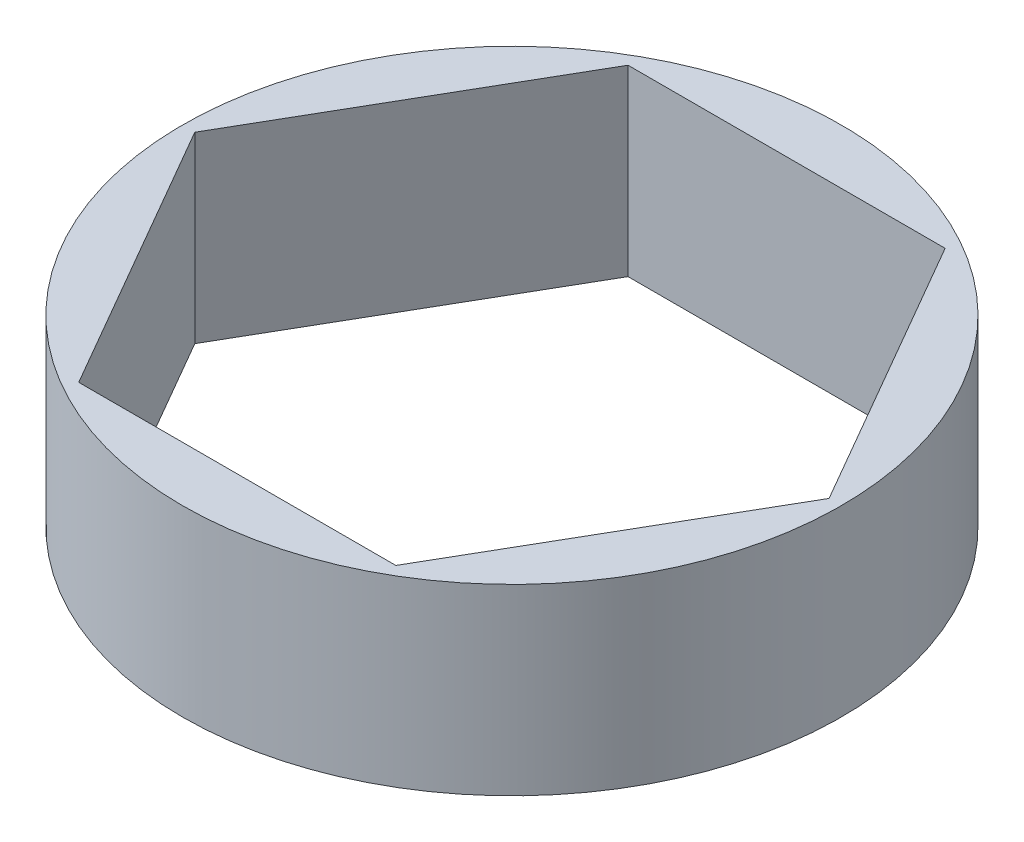
ISO-10303-21;
HEADER;
FILE_DESCRIPTION(('STEP AP214'),'2;1');
FILE_NAME('part.step','',(''),(''),'','','');
FILE_SCHEMA(('AUTOMOTIVE_DESIGN { 1 0 10303 214 1 1 1 1 }'));
ENDSEC;
DATA;
#1=APPLICATION_CONTEXT('core data for automotive mechanical design processes');
#2=APPLICATION_PROTOCOL_DEFINITION('international standard','automotive_design',2000,#1);
#3=PRODUCT_CONTEXT('',#1,'mechanical');
#4=PRODUCT('Part','Part','',(#3));
#5=PRODUCT_RELATED_PRODUCT_CATEGORY('part','',(#4));
#6=PRODUCT_DEFINITION_FORMATION('','',#4);
#7=PRODUCT_DEFINITION_CONTEXT('part definition',#1,'design');
#8=PRODUCT_DEFINITION('design','',#6,#7);
#9=PRODUCT_DEFINITION_SHAPE('','',#8);
#10=(LENGTH_UNIT() NAMED_UNIT(*) SI_UNIT(.MILLI.,.METRE.));
#11=(NAMED_UNIT(*) PLANE_ANGLE_UNIT() SI_UNIT($,.RADIAN.));
#12=(NAMED_UNIT(*) SI_UNIT($,.STERADIAN.) SOLID_ANGLE_UNIT());
#13=UNCERTAINTY_MEASURE_WITH_UNIT(LENGTH_MEASURE(1.E-05),#10,'distance_accuracy_value','');
#14=(GEOMETRIC_REPRESENTATION_CONTEXT(3) GLOBAL_UNCERTAINTY_ASSIGNED_CONTEXT((#13)) GLOBAL_UNIT_ASSIGNED_CONTEXT((#10,
#11,#12)) REPRESENTATION_CONTEXT('',''));
#15=CARTESIAN_POINT('',(0.,0.,0.));
#16=DIRECTION('',(0.,0.,1.));
#17=DIRECTION('',(1.,0.,0.));
#18=AXIS2_PLACEMENT_3D('',#15,#16,#17);
#19=CARTESIAN_POINT('',(0.,5.,0.));
#20=DIRECTION('',(0.,1.,0.));
#21=DIRECTION('',(0.,0.,1.));
#22=AXIS2_PLACEMENT_3D('',#19,#20,#21);
#23=PLANE('',#22);
#24=CARTESIAN_POINT('',(0.,5.,0.));
#25=DIRECTION('',(0.,1.,0.));
#26=DIRECTION('',(0.,0.,1.));
#27=AXIS2_PLACEMENT_3D('',#24,#25,#26);
#28=CIRCLE('',#27,9.);
#29=CARTESIAN_POINT('',(0.,5.,9.));
#30=VERTEX_POINT('',#29);
#31=EDGE_CURVE('E11',#30,#30,#28,.T.);
#32=ORIENTED_EDGE('',*,*,#31,.T.);
#33=EDGE_LOOP('',(#32));
#34=FACE_BOUND('',#33,.T.);
#35=DIRECTION('',(-0.5,0.,-0.866025403784439));
#36=VECTOR('',#35,1.);
#37=CARTESIAN_POINT('',(8.66025403784439,5.,0.));
#38=LINE('',#37,#36);
#39=CARTESIAN_POINT('',(8.66025403784439,5.,0.));
#40=VERTEX_POINT('',#39);
#41=CARTESIAN_POINT('',(4.33012701892219,5.,-7.5));
#42=VERTEX_POINT('',#41);
#43=EDGE_CURVE('E103',#40,#42,#38,.T.);
#44=ORIENTED_EDGE('',*,*,#43,.F.);
#45=DIRECTION('',(0.5,0.,-0.866025403784439));
#46=VECTOR('',#45,1.);
#47=CARTESIAN_POINT('',(4.33012701892219,5.,7.5));
#48=LINE('',#47,#46);
#49=CARTESIAN_POINT('',(4.33012701892219,5.,7.5));
#50=VERTEX_POINT('',#49);
#51=EDGE_CURVE('E94',#50,#40,#48,.T.);
#52=ORIENTED_EDGE('',*,*,#51,.F.);
#53=DIRECTION('',(1.,0.,0.));
#54=VECTOR('',#53,1.);
#55=CARTESIAN_POINT('',(-4.33012701892219,5.,7.5));
#56=LINE('',#55,#54);
#57=CARTESIAN_POINT('',(-4.33012701892219,5.,7.5));
#58=VERTEX_POINT('',#57);
#59=EDGE_CURVE('E128',#58,#50,#56,.T.);
#60=ORIENTED_EDGE('',*,*,#59,.F.);
#61=DIRECTION('',(0.5,0.,0.866025403784439));
#62=VECTOR('',#61,1.);
#63=CARTESIAN_POINT('',(-8.66025403784439,5.,0.));
#64=LINE('',#63,#62);
#65=CARTESIAN_POINT('',(-8.66025403784439,5.,0.));
#66=VERTEX_POINT('',#65);
#67=EDGE_CURVE('E125',#66,#58,#64,.T.);
#68=ORIENTED_EDGE('',*,*,#67,.F.);
#69=DIRECTION('',(-0.5,0.,0.866025403784439));
#70=VECTOR('',#69,1.);
#71=CARTESIAN_POINT('',(-4.33012701892219,5.,-7.5));
#72=LINE('',#71,#70);
#73=CARTESIAN_POINT('',(-4.33012701892219,5.,-7.5));
#74=VERTEX_POINT('',#73);
#75=EDGE_CURVE('E120',#74,#66,#72,.T.);
#76=ORIENTED_EDGE('',*,*,#75,.F.);
#77=DIRECTION('',(-1.,0.,0.));
#78=VECTOR('',#77,1.);
#79=CARTESIAN_POINT('',(4.33012701892219,5.,-7.5));
#80=LINE('',#79,#78);
#81=EDGE_CURVE('E116',#42,#74,#80,.T.);
#82=ORIENTED_EDGE('',*,*,#81,.F.);
#83=EDGE_LOOP('',(#44,#52,#60,#68,#76,#82));
#84=FACE_BOUND('',#83,.T.);
#85=ADVANCED_FACE('F40',(#34,#84),#23,.T.);
#86=CARTESIAN_POINT('',(0.,0.,0.));
#87=DIRECTION('',(0.,1.,0.));
#88=DIRECTION('',(0.,0.,1.));
#89=AXIS2_PLACEMENT_3D('',#86,#87,#88);
#90=PLANE('',#89);
#91=CARTESIAN_POINT('',(0.,0.,0.));
#92=DIRECTION('',(0.,1.,0.));
#93=DIRECTION('',(0.,0.,1.));
#94=AXIS2_PLACEMENT_3D('',#91,#92,#93);
#95=CIRCLE('',#94,9.);
#96=CARTESIAN_POINT('',(0.,0.,9.));
#97=VERTEX_POINT('',#96);
#98=EDGE_CURVE('E44',#97,#97,#95,.T.);
#99=ORIENTED_EDGE('',*,*,#98,.F.);
#100=EDGE_LOOP('',(#99));
#101=FACE_BOUND('',#100,.T.);
#102=DIRECTION('',(0.5,0.,-0.866025403784439));
#103=VECTOR('',#102,1.);
#104=CARTESIAN_POINT('',(4.33012701892219,0.,7.5));
#105=LINE('',#104,#103);
#106=CARTESIAN_POINT('',(4.33012701892219,0.,7.5));
#107=VERTEX_POINT('',#106);
#108=CARTESIAN_POINT('',(8.66025403784439,0.,0.));
#109=VERTEX_POINT('',#108);
#110=EDGE_CURVE('E64',#107,#109,#105,.T.);
#111=ORIENTED_EDGE('',*,*,#110,.T.);
#112=DIRECTION('',(-0.5,0.,-0.866025403784439));
#113=VECTOR('',#112,1.);
#114=CARTESIAN_POINT('',(8.66025403784439,0.,0.));
#115=LINE('',#114,#113);
#116=CARTESIAN_POINT('',(4.33012701892219,0.,-7.5));
#117=VERTEX_POINT('',#116);
#118=EDGE_CURVE('E110',#109,#117,#115,.T.);
#119=ORIENTED_EDGE('',*,*,#118,.T.);
#120=DIRECTION('',(-1.,0.,0.));
#121=VECTOR('',#120,1.);
#122=CARTESIAN_POINT('',(4.33012701892219,0.,-7.5));
#123=LINE('',#122,#121);
#124=CARTESIAN_POINT('',(-4.33012701892219,0.,-7.5));
#125=VERTEX_POINT('',#124);
#126=EDGE_CURVE('E135',#117,#125,#123,.T.);
#127=ORIENTED_EDGE('',*,*,#126,.T.);
#128=DIRECTION('',(-0.5,0.,0.866025403784439));
#129=VECTOR('',#128,1.);
#130=CARTESIAN_POINT('',(-4.33012701892219,0.,-7.5));
#131=LINE('',#130,#129);
#132=CARTESIAN_POINT('',(-8.66025403784439,0.,0.));
#133=VERTEX_POINT('',#132);
#134=EDGE_CURVE('E139',#125,#133,#131,.T.);
#135=ORIENTED_EDGE('',*,*,#134,.T.);
#136=DIRECTION('',(0.5,0.,0.866025403784439));
#137=VECTOR('',#136,1.);
#138=CARTESIAN_POINT('',(-8.66025403784439,0.,0.));
#139=LINE('',#138,#137);
#140=CARTESIAN_POINT('',(-4.33012701892219,0.,7.5));
#141=VERTEX_POINT('',#140);
#142=EDGE_CURVE('E143',#133,#141,#139,.T.);
#143=ORIENTED_EDGE('',*,*,#142,.T.);
#144=DIRECTION('',(1.,0.,0.));
#145=VECTOR('',#144,1.);
#146=CARTESIAN_POINT('',(-4.33012701892219,0.,7.5));
#147=LINE('',#146,#145);
#148=EDGE_CURVE('E104',#141,#107,#147,.T.);
#149=ORIENTED_EDGE('',*,*,#148,.T.);
#150=EDGE_LOOP('',(#111,#119,#127,#135,#143,#149));
#151=FACE_BOUND('',#150,.T.);
#152=ADVANCED_FACE('F167',(#101,#151),#90,.F.);
#153=CARTESIAN_POINT('',(0.,5.,0.));
#154=DIRECTION('',(0.,-1.,0.));
#155=DIRECTION('',(0.,0.,-1.));
#156=AXIS2_PLACEMENT_3D('',#153,#154,#155);
#157=CYLINDRICAL_SURFACE('',#156,9.);
#158=ORIENTED_EDGE('',*,*,#31,.F.);
#159=EDGE_LOOP('',(#158));
#160=FACE_BOUND('',#159,.T.);
#161=ORIENTED_EDGE('',*,*,#98,.T.);
#162=EDGE_LOOP('',(#161));
#163=FACE_BOUND('',#162,.T.);
#164=ADVANCED_FACE('F42',(#160,#163),#157,.T.);
#165=CARTESIAN_POINT('',(4.33012701892219,5.,7.5));
#166=DIRECTION('',(-0.866025403784439,0.,-0.5));
#167=DIRECTION('',(-0.5,0.,0.866025403784439));
#168=AXIS2_PLACEMENT_3D('',#165,#166,#167);
#169=PLANE('',#168);
#170=ORIENTED_EDGE('',*,*,#110,.F.);
#171=DIRECTION('',(0.,-1.,0.));
#172=VECTOR('',#171,1.);
#173=CARTESIAN_POINT('',(4.33012701892219,5.,7.5));
#174=LINE('',#173,#172);
#175=EDGE_CURVE('E98',#50,#107,#174,.T.);
#176=ORIENTED_EDGE('',*,*,#175,.F.);
#177=ORIENTED_EDGE('',*,*,#51,.T.);
#178=DIRECTION('',(0.,-1.,0.));
#179=VECTOR('',#178,1.);
#180=CARTESIAN_POINT('',(8.66025403784439,5.,0.));
#181=LINE('',#180,#179);
#182=EDGE_CURVE('E97',#40,#109,#181,.T.);
#183=ORIENTED_EDGE('',*,*,#182,.T.);
#184=EDGE_LOOP('',(#170,#176,#177,#183));
#185=FACE_BOUND('',#184,.T.);
#186=ADVANCED_FACE('F96',(#185),#169,.T.);
#187=CARTESIAN_POINT('',(8.66025403784439,5.,0.));
#188=DIRECTION('',(-0.866025403784439,0.,0.5));
#189=DIRECTION('',(0.5,0.,0.866025403784439));
#190=AXIS2_PLACEMENT_3D('',#187,#188,#189);
#191=PLANE('',#190);
#192=ORIENTED_EDGE('',*,*,#118,.F.);
#193=ORIENTED_EDGE('',*,*,#182,.F.);
#194=ORIENTED_EDGE('',*,*,#43,.T.);
#195=DIRECTION('',(0.,-1.,0.));
#196=VECTOR('',#195,1.);
#197=CARTESIAN_POINT('',(4.33012701892219,5.,-7.5));
#198=LINE('',#197,#196);
#199=EDGE_CURVE('E112',#42,#117,#198,.T.);
#200=ORIENTED_EDGE('',*,*,#199,.T.);
#201=EDGE_LOOP('',(#192,#193,#194,#200));
#202=FACE_BOUND('',#201,.T.);
#203=ADVANCED_FACE('F107',(#202),#191,.T.);
#204=CARTESIAN_POINT('',(4.33012701892219,5.,-7.5));
#205=DIRECTION('',(0.,0.,1.));
#206=DIRECTION('',(1.,0.,0.));
#207=AXIS2_PLACEMENT_3D('',#204,#205,#206);
#208=PLANE('',#207);
#209=ORIENTED_EDGE('',*,*,#126,.F.);
#210=ORIENTED_EDGE('',*,*,#199,.F.);
#211=ORIENTED_EDGE('',*,*,#81,.T.);
#212=DIRECTION('',(0.,-1.,0.));
#213=VECTOR('',#212,1.);
#214=CARTESIAN_POINT('',(-4.33012701892219,5.,-7.5));
#215=LINE('',#214,#213);
#216=EDGE_CURVE('E157',#74,#125,#215,.T.);
#217=ORIENTED_EDGE('',*,*,#216,.T.);
#218=EDGE_LOOP('',(#209,#210,#211,#217));
#219=FACE_BOUND('',#218,.T.);
#220=ADVANCED_FACE('F163',(#219),#208,.T.);
#221=CARTESIAN_POINT('',(-4.33012701892219,5.,-7.5));
#222=DIRECTION('',(0.866025403784438,0.,0.5));
#223=DIRECTION('',(0.5,0.,-0.866025403784439));
#224=AXIS2_PLACEMENT_3D('',#221,#222,#223);
#225=PLANE('',#224);
#226=ORIENTED_EDGE('',*,*,#134,.F.);
#227=ORIENTED_EDGE('',*,*,#216,.F.);
#228=ORIENTED_EDGE('',*,*,#75,.T.);
#229=DIRECTION('',(0.,-1.,0.));
#230=VECTOR('',#229,1.);
#231=CARTESIAN_POINT('',(-8.66025403784439,5.,0.));
#232=LINE('',#231,#230);
#233=EDGE_CURVE('E154',#66,#133,#232,.T.);
#234=ORIENTED_EDGE('',*,*,#233,.T.);
#235=EDGE_LOOP('',(#226,#227,#228,#234));
#236=FACE_BOUND('',#235,.T.);
#237=ADVANCED_FACE('F175',(#236),#225,.T.);
#238=CARTESIAN_POINT('',(-8.66025403784439,5.,0.));
#239=DIRECTION('',(0.866025403784439,0.,-0.5));
#240=DIRECTION('',(-0.5,0.,-0.866025403784439));
#241=AXIS2_PLACEMENT_3D('',#238,#239,#240);
#242=PLANE('',#241);
#243=ORIENTED_EDGE('',*,*,#142,.F.);
#244=ORIENTED_EDGE('',*,*,#233,.F.);
#245=ORIENTED_EDGE('',*,*,#67,.T.);
#246=DIRECTION('',(0.,-1.,0.));
#247=VECTOR('',#246,1.);
#248=CARTESIAN_POINT('',(-4.33012701892219,5.,7.5));
#249=LINE('',#248,#247);
#250=EDGE_CURVE('E56',#58,#141,#249,.T.);
#251=ORIENTED_EDGE('',*,*,#250,.T.);
#252=EDGE_LOOP('',(#243,#244,#245,#251));
#253=FACE_BOUND('',#252,.T.);
#254=ADVANCED_FACE('F173',(#253),#242,.T.);
#255=CARTESIAN_POINT('',(-4.33012701892219,5.,7.5));
#256=DIRECTION('',(0.,0.,-1.));
#257=DIRECTION('',(-1.,0.,0.));
#258=AXIS2_PLACEMENT_3D('',#255,#256,#257);
#259=PLANE('',#258);
#260=ORIENTED_EDGE('',*,*,#148,.F.);
#261=ORIENTED_EDGE('',*,*,#250,.F.);
#262=ORIENTED_EDGE('',*,*,#59,.T.);
#263=ORIENTED_EDGE('',*,*,#175,.T.);
#264=EDGE_LOOP('',(#260,#261,#262,#263));
#265=FACE_BOUND('',#264,.T.);
#266=ADVANCED_FACE('F169',(#265),#259,.T.);
#267=CLOSED_SHELL('',(#85,#152,#164,#186,#203,#220,#237,#254,#266));
#268=MANIFOLD_SOLID_BREP('B2',#267);
#269=ADVANCED_BREP_SHAPE_REPRESENTATION('',(#18,#268),#14);
#270=SHAPE_DEFINITION_REPRESENTATION(#9,#269);
ENDSEC;
END-ISO-10303-21;
